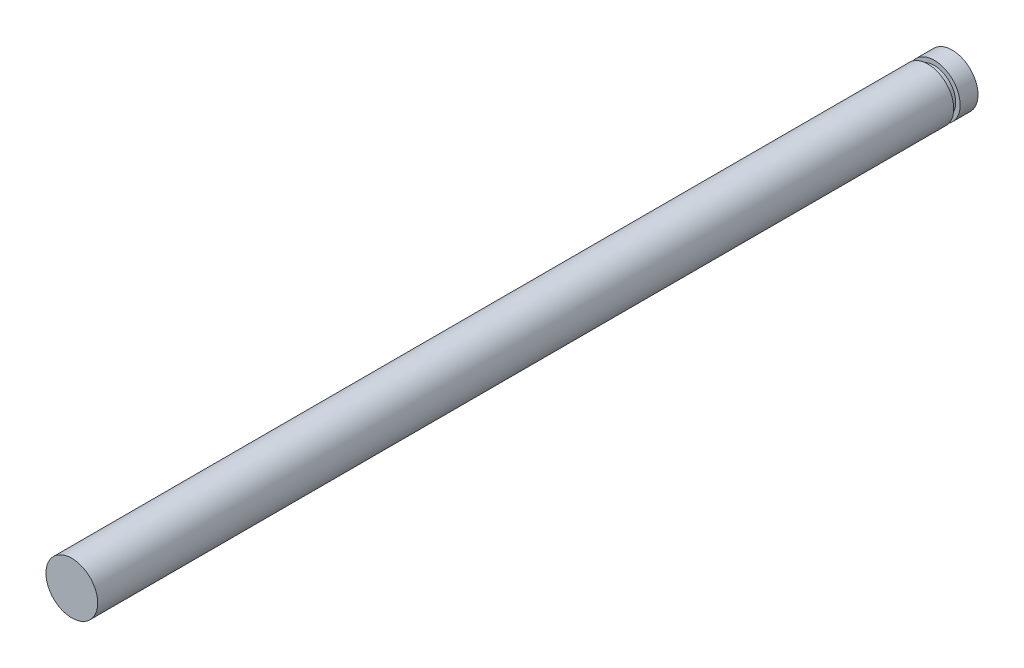
ISO-10303-21;
HEADER;
FILE_DESCRIPTION(('STEP AP214'),'2;1');
FILE_NAME('part.step','',(''),(''),'','','');
FILE_SCHEMA(('AUTOMOTIVE_DESIGN { 1 0 10303 214 1 1 1 1 }'));
ENDSEC;
DATA;
#1=APPLICATION_CONTEXT('core data for automotive mechanical design processes');
#2=APPLICATION_PROTOCOL_DEFINITION('international standard','automotive_design',2000,#1);
#3=PRODUCT_CONTEXT('',#1,'mechanical');
#4=PRODUCT('Part','Part','',(#3));
#5=PRODUCT_RELATED_PRODUCT_CATEGORY('part','',(#4));
#6=PRODUCT_DEFINITION_FORMATION('','',#4);
#7=PRODUCT_DEFINITION_CONTEXT('part definition',#1,'design');
#8=PRODUCT_DEFINITION('design','',#6,#7);
#9=PRODUCT_DEFINITION_SHAPE('','',#8);
#10=(LENGTH_UNIT() NAMED_UNIT(*) SI_UNIT(.MILLI.,.METRE.));
#11=(NAMED_UNIT(*) PLANE_ANGLE_UNIT() SI_UNIT($,.RADIAN.));
#12=(NAMED_UNIT(*) SI_UNIT($,.STERADIAN.) SOLID_ANGLE_UNIT());
#13=UNCERTAINTY_MEASURE_WITH_UNIT(LENGTH_MEASURE(1.E-05),#10,'distance_accuracy_value','');
#14=(GEOMETRIC_REPRESENTATION_CONTEXT(3) GLOBAL_UNCERTAINTY_ASSIGNED_CONTEXT((#13)) GLOBAL_UNIT_ASSIGNED_CONTEXT((#10,
#11,#12)) REPRESENTATION_CONTEXT('',''));
#15=CARTESIAN_POINT('',(0.,0.,0.));
#16=DIRECTION('',(0.,0.,1.));
#17=DIRECTION('',(1.,0.,0.));
#18=AXIS2_PLACEMENT_3D('',#15,#16,#17);
#19=CARTESIAN_POINT('',(0.,0.,300.435604446166));
#20=DIRECTION('',(0.,0.,-1.));
#21=DIRECTION('',(-1.,0.,0.));
#22=AXIS2_PLACEMENT_3D('',#19,#20,#21);
#23=PLANE('',#22);
#24=CARTESIAN_POINT('',(0.,0.,300.435604446166));
#25=DIRECTION('',(0.,0.,1.));
#26=DIRECTION('',(1.,0.,0.));
#27=AXIS2_PLACEMENT_3D('',#24,#25,#26);
#28=CIRCLE('',#27,18.415);
#29=CARTESIAN_POINT('',(18.415,0.,300.435604446166));
#30=VERTEX_POINT('',#29);
#31=EDGE_CURVE('E10',#30,#30,#28,.T.);
#32=ORIENTED_EDGE('',*,*,#31,.T.);
#33=EDGE_LOOP('',(#32));
#34=FACE_BOUND('',#33,.T.);
#35=ADVANCED_FACE('F37',(#34),#23,.F.);
#36=CARTESIAN_POINT('',(0.,0.,300.435604446166));
#37=DIRECTION('',(0.,0.,1.));
#38=DIRECTION('',(1.,0.,0.));
#39=AXIS2_PLACEMENT_3D('',#36,#37,#38);
#40=CYLINDRICAL_SURFACE('',#39,18.415);
#41=ORIENTED_EDGE('',*,*,#31,.F.);
#42=EDGE_LOOP('',(#41));
#43=FACE_BOUND('',#42,.T.);
#44=CARTESIAN_POINT('',(0.,0.,-309.164395553834));
#45=DIRECTION('',(0.,0.,1.));
#46=DIRECTION('',(1.,0.,0.));
#47=AXIS2_PLACEMENT_3D('',#44,#45,#46);
#48=CIRCLE('',#47,18.415);
#49=CARTESIAN_POINT('',(18.415,0.,-309.164395553834));
#50=VERTEX_POINT('',#49);
#51=EDGE_CURVE('E43',#50,#50,#48,.T.);
#52=ORIENTED_EDGE('',*,*,#51,.T.);
#53=EDGE_LOOP('',(#52));
#54=FACE_BOUND('',#53,.T.);
#55=ADVANCED_FACE('F75',(#43,#54),#40,.T.);
#56=CARTESIAN_POINT('',(0.,18.415,-309.164395553834));
#57=DIRECTION('',(0.,0.,1.));
#58=DIRECTION('',(1.,0.,0.));
#59=AXIS2_PLACEMENT_3D('',#56,#57,#58);
#60=PLANE('',#59);
#61=ORIENTED_EDGE('',*,*,#51,.F.);
#62=EDGE_LOOP('',(#61));
#63=FACE_BOUND('',#62,.T.);
#64=CARTESIAN_POINT('',(0.,0.,-309.164395553834));
#65=DIRECTION('',(0.,0.,1.));
#66=DIRECTION('',(1.,0.,0.));
#67=AXIS2_PLACEMENT_3D('',#64,#65,#66);
#68=CIRCLE('',#67,15.24);
#69=CARTESIAN_POINT('',(15.24,0.,-309.164395553834));
#70=VERTEX_POINT('',#69);
#71=EDGE_CURVE('E47',#70,#70,#68,.T.);
#72=ORIENTED_EDGE('',*,*,#71,.T.);
#73=EDGE_LOOP('',(#72));
#74=FACE_BOUND('',#73,.T.);
#75=ADVANCED_FACE('F79',(#63,#74),#60,.F.);
#76=CARTESIAN_POINT('',(0.,0.,300.435604446166));
#77=DIRECTION('',(0.,0.,1.));
#78=DIRECTION('',(1.,0.,0.));
#79=AXIS2_PLACEMENT_3D('',#76,#77,#78);
#80=CYLINDRICAL_SURFACE('',#79,15.24);
#81=ORIENTED_EDGE('',*,*,#71,.F.);
#82=EDGE_LOOP('',(#81));
#83=FACE_BOUND('',#82,.T.);
#84=CARTESIAN_POINT('',(0.,0.,-313.736395553834));
#85=DIRECTION('',(0.,0.,1.));
#86=DIRECTION('',(1.,0.,0.));
#87=AXIS2_PLACEMENT_3D('',#84,#85,#86);
#88=CIRCLE('',#87,15.24);
#89=CARTESIAN_POINT('',(15.24,0.,-313.736395553834));
#90=VERTEX_POINT('',#89);
#91=EDGE_CURVE('E51',#90,#90,#88,.T.);
#92=ORIENTED_EDGE('',*,*,#91,.T.);
#93=EDGE_LOOP('',(#92));
#94=FACE_BOUND('',#93,.T.);
#95=ADVANCED_FACE('F84',(#83,#94),#80,.T.);
#96=CARTESIAN_POINT('',(0.,15.24,-313.736395553834));
#97=DIRECTION('',(0.,0.,-1.));
#98=DIRECTION('',(-1.,0.,0.));
#99=AXIS2_PLACEMENT_3D('',#96,#97,#98);
#100=PLANE('',#99);
#101=ORIENTED_EDGE('',*,*,#91,.F.);
#102=EDGE_LOOP('',(#101));
#103=FACE_BOUND('',#102,.T.);
#104=CARTESIAN_POINT('',(0.,0.,-313.736395553834));
#105=DIRECTION('',(0.,0.,1.));
#106=DIRECTION('',(1.,0.,0.));
#107=AXIS2_PLACEMENT_3D('',#104,#105,#106);
#108=CIRCLE('',#107,18.415);
#109=CARTESIAN_POINT('',(18.415,0.,-313.736395553834));
#110=VERTEX_POINT('',#109);
#111=EDGE_CURVE('E56',#110,#110,#108,.T.);
#112=ORIENTED_EDGE('',*,*,#111,.T.);
#113=EDGE_LOOP('',(#112));
#114=FACE_BOUND('',#113,.T.);
#115=ADVANCED_FACE('F71',(#103,#114),#100,.F.);
#116=CARTESIAN_POINT('',(0.,0.,300.435604446166));
#117=DIRECTION('',(0.,0.,1.));
#118=DIRECTION('',(1.,0.,0.));
#119=AXIS2_PLACEMENT_3D('',#116,#117,#118);
#120=CYLINDRICAL_SURFACE('',#119,18.415);
#121=ORIENTED_EDGE('',*,*,#111,.F.);
#122=EDGE_LOOP('',(#121));
#123=FACE_BOUND('',#122,.T.);
#124=CARTESIAN_POINT('',(0.,0.,-326.436395553834));
#125=DIRECTION('',(0.,0.,1.));
#126=DIRECTION('',(1.,0.,0.));
#127=AXIS2_PLACEMENT_3D('',#124,#125,#126);
#128=CIRCLE('',#127,18.415);
#129=CARTESIAN_POINT('',(18.415,0.,-326.436395553834));
#130=VERTEX_POINT('',#129);
#131=EDGE_CURVE('E59',#130,#130,#128,.T.);
#132=ORIENTED_EDGE('',*,*,#131,.T.);
#133=EDGE_LOOP('',(#132));
#134=FACE_BOUND('',#133,.T.);
#135=ADVANCED_FACE('F63',(#123,#134),#120,.T.);
#136=CARTESIAN_POINT('',(0.,18.415,-326.436395553834));
#137=DIRECTION('',(0.,0.,1.));
#138=DIRECTION('',(1.,0.,0.));
#139=AXIS2_PLACEMENT_3D('',#136,#137,#138);
#140=PLANE('',#139);
#141=ORIENTED_EDGE('',*,*,#131,.F.);
#142=EDGE_LOOP('',(#141));
#143=FACE_BOUND('',#142,.T.);
#144=ADVANCED_FACE('F65',(#143),#140,.F.);
#145=CLOSED_SHELL('',(#35,#55,#75,#95,#115,#135,#144));
#146=MANIFOLD_SOLID_BREP('B2',#145);
#147=ADVANCED_BREP_SHAPE_REPRESENTATION('',(#18,#146),#14);
#148=SHAPE_DEFINITION_REPRESENTATION(#9,#147);
ENDSEC;
END-ISO-10303-21;
